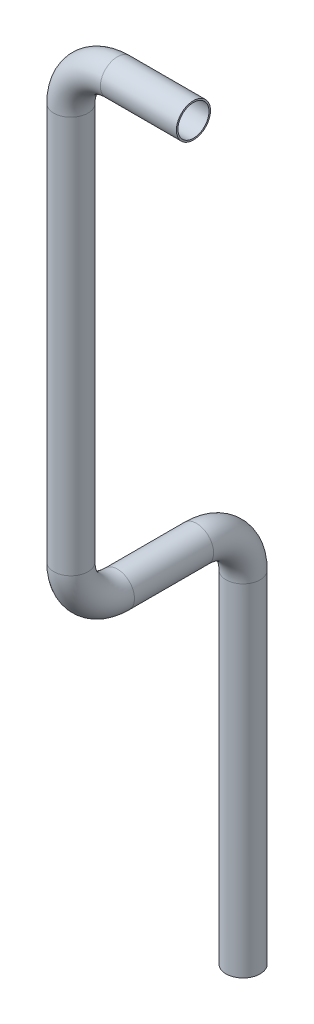
ISO-10303-21;
HEADER;
FILE_DESCRIPTION(('STEP AP214'),'2;1');
FILE_NAME('part.step','',(''),(''),'','','');
FILE_SCHEMA(('AUTOMOTIVE_DESIGN { 1 0 10303 214 1 1 1 1 }'));
ENDSEC;
DATA;
#1=APPLICATION_CONTEXT('core data for automotive mechanical design processes');
#2=APPLICATION_PROTOCOL_DEFINITION('international standard','automotive_design',2000,#1);
#3=PRODUCT_CONTEXT('',#1,'mechanical');
#4=PRODUCT('Part','Part','',(#3));
#5=PRODUCT_RELATED_PRODUCT_CATEGORY('part','',(#4));
#6=PRODUCT_DEFINITION_FORMATION('','',#4);
#7=PRODUCT_DEFINITION_CONTEXT('part definition',#1,'design');
#8=PRODUCT_DEFINITION('design','',#6,#7);
#9=PRODUCT_DEFINITION_SHAPE('','',#8);
#10=(LENGTH_UNIT() NAMED_UNIT(*) SI_UNIT(.MILLI.,.METRE.));
#11=(NAMED_UNIT(*) PLANE_ANGLE_UNIT() SI_UNIT($,.RADIAN.));
#12=(NAMED_UNIT(*) SI_UNIT($,.STERADIAN.) SOLID_ANGLE_UNIT());
#13=UNCERTAINTY_MEASURE_WITH_UNIT(LENGTH_MEASURE(1.E-05),#10,'distance_accuracy_value','');
#14=(GEOMETRIC_REPRESENTATION_CONTEXT(3) GLOBAL_UNCERTAINTY_ASSIGNED_CONTEXT((#13)) GLOBAL_UNIT_ASSIGNED_CONTEXT((#10,
#11,#12)) REPRESENTATION_CONTEXT('',''));
#15=CARTESIAN_POINT('',(0.,0.,0.));
#16=DIRECTION('',(0.,0.,1.));
#17=DIRECTION('',(1.,0.,0.));
#18=AXIS2_PLACEMENT_3D('',#15,#16,#17);
#19=CARTESIAN_POINT('',(15.,283.,55.5000000000001));
#20=DIRECTION('',(1.,0.,0.));
#21=DIRECTION('',(0.,0.,-1.));
#22=AXIS2_PLACEMENT_3D('',#19,#20,#21);
#23=CYLINDRICAL_SURFACE('',#22,5.5);
#24=CARTESIAN_POINT('',(15.,283.,55.5000000000001));
#25=DIRECTION('',(1.,0.,0.));
#26=DIRECTION('',(0.,0.,1.));
#27=AXIS2_PLACEMENT_3D('',#24,#25,#26);
#28=CIRCLE('',#27,5.5);
#29=CARTESIAN_POINT('',(15.,288.5,55.5000000000001));
#30=VERTEX_POINT('',#29);
#31=EDGE_CURVE('E45',#30,#30,#28,.T.);
#32=ORIENTED_EDGE('',*,*,#31,.T.);
#33=EDGE_LOOP('',(#32));
#34=FACE_BOUND('',#33,.T.);
#35=CARTESIAN_POINT('',(39.5,283.,55.5000000000001));
#36=DIRECTION('',(1.,0.,0.));
#37=DIRECTION('',(0.,0.,1.));
#38=AXIS2_PLACEMENT_3D('',#35,#36,#37);
#39=CIRCLE('',#38,5.5);
#40=CARTESIAN_POINT('',(39.5,283.,61.0000000000001));
#41=VERTEX_POINT('',#40);
#42=EDGE_CURVE('E10',#41,#41,#39,.T.);
#43=ORIENTED_EDGE('',*,*,#42,.F.);
#44=EDGE_LOOP('',(#43));
#45=FACE_BOUND('',#44,.T.);
#46=ADVANCED_FACE('F35',(#34,#45),#23,.T.);
#47=CARTESIAN_POINT('',(15.,283.,55.5000000000001));
#48=DIRECTION('',(1.,0.,0.));
#49=DIRECTION('',(0.,0.,-1.));
#50=AXIS2_PLACEMENT_3D('',#47,#48,#49);
#51=CYLINDRICAL_SURFACE('',#50,5.);
#52=CARTESIAN_POINT('',(15.,283.,55.5000000000001));
#53=DIRECTION('',(1.,0.,0.));
#54=DIRECTION('',(0.,0.,1.));
#55=AXIS2_PLACEMENT_3D('',#52,#53,#54);
#56=CIRCLE('',#55,5.);
#57=CARTESIAN_POINT('',(15.,288.,55.5000000000001));
#58=VERTEX_POINT('',#57);
#59=EDGE_CURVE('E49',#58,#58,#56,.T.);
#60=ORIENTED_EDGE('',*,*,#59,.F.);
#61=EDGE_LOOP('',(#60));
#62=FACE_BOUND('',#61,.T.);
#63=CARTESIAN_POINT('',(39.5,283.,55.5000000000001));
#64=DIRECTION('',(1.,0.,0.));
#65=DIRECTION('',(0.,0.,1.));
#66=AXIS2_PLACEMENT_3D('',#63,#64,#65);
#67=CIRCLE('',#66,5.);
#68=CARTESIAN_POINT('',(39.5,283.,60.5000000000001));
#69=VERTEX_POINT('',#68);
#70=EDGE_CURVE('E41',#69,#69,#67,.T.);
#71=ORIENTED_EDGE('',*,*,#70,.T.);
#72=EDGE_LOOP('',(#71));
#73=FACE_BOUND('',#72,.T.);
#74=ADVANCED_FACE('F129',(#62,#73),#51,.F.);
#75=CARTESIAN_POINT('',(15.,268.,55.5000000000001));
#76=DIRECTION('',(0.,0.,-1.));
#77=DIRECTION('',(-1.,0.,0.));
#78=AXIS2_PLACEMENT_3D('',#75,#76,#77);
#79=TOROIDAL_SURFACE('',#78,15.,5.5);
#80=CARTESIAN_POINT('',(0.,268.,55.5000000000001));
#81=DIRECTION('',(0.,1.,0.));
#82=DIRECTION('',(0.,0.,1.));
#83=AXIS2_PLACEMENT_3D('',#80,#81,#82);
#84=CIRCLE('',#83,5.5);
#85=CARTESIAN_POINT('',(-5.5,268.,55.5000000000001));
#86=VERTEX_POINT('',#85);
#87=EDGE_CURVE('E54',#86,#86,#84,.T.);
#88=CARTESIAN_POINT('',(15.,268.,55.5000000000001));
#89=DIRECTION('',(0.,0.,-1.));
#90=DIRECTION('',(-1.,0.,0.));
#91=AXIS2_PLACEMENT_3D('',#88,#89,#90);
#92=CIRCLE('',#91,20.5);
#93=EDGE_CURVE('',#86,#30,#92,.T.);
#94=ORIENTED_EDGE('',*,*,#87,.T.);
#95=ORIENTED_EDGE('',*,*,#31,.F.);
#96=ORIENTED_EDGE('',*,*,#93,.T.);
#97=ORIENTED_EDGE('',*,*,#93,.F.);
#98=EDGE_LOOP('',(#94,#96,#95,#97));
#99=FACE_BOUND('',#98,.T.);
#100=ADVANCED_FACE('F125',(#99),#79,.T.);
#101=CARTESIAN_POINT('',(15.,268.,55.5000000000001));
#102=DIRECTION('',(0.,0.,-1.));
#103=DIRECTION('',(-1.,0.,0.));
#104=AXIS2_PLACEMENT_3D('',#101,#102,#103);
#105=TOROIDAL_SURFACE('',#104,15.,5.);
#106=CARTESIAN_POINT('',(0.,268.,55.5000000000001));
#107=DIRECTION('',(0.,1.,0.));
#108=DIRECTION('',(0.,0.,1.));
#109=AXIS2_PLACEMENT_3D('',#106,#107,#108);
#110=CIRCLE('',#109,5.);
#111=CARTESIAN_POINT('',(-5.,268.,55.5000000000001));
#112=VERTEX_POINT('',#111);
#113=EDGE_CURVE('E57',#112,#112,#110,.T.);
#114=CARTESIAN_POINT('',(15.,268.,55.5000000000001));
#115=DIRECTION('',(0.,0.,-1.));
#116=DIRECTION('',(-1.,0.,0.));
#117=AXIS2_PLACEMENT_3D('',#114,#115,#116);
#118=CIRCLE('',#117,20.);
#119=EDGE_CURVE('',#112,#58,#118,.T.);
#120=ORIENTED_EDGE('',*,*,#113,.F.);
#121=ORIENTED_EDGE('',*,*,#59,.T.);
#122=ORIENTED_EDGE('',*,*,#119,.T.);
#123=ORIENTED_EDGE('',*,*,#119,.F.);
#124=EDGE_LOOP('',(#120,#122,#121,#123));
#125=FACE_BOUND('',#124,.T.);
#126=ADVANCED_FACE('F122',(#125),#105,.F.);
#127=CARTESIAN_POINT('',(0.,140.,55.5000000000001));
#128=DIRECTION('',(0.,1.,0.));
#129=DIRECTION('',(0.,0.,1.));
#130=AXIS2_PLACEMENT_3D('',#127,#128,#129);
#131=CYLINDRICAL_SURFACE('',#130,5.5);
#132=CARTESIAN_POINT('',(0.,140.,55.5000000000001));
#133=DIRECTION('',(0.,1.,0.));
#134=DIRECTION('',(0.,0.,1.));
#135=AXIS2_PLACEMENT_3D('',#132,#133,#134);
#136=CIRCLE('',#135,5.5);
#137=CARTESIAN_POINT('',(0.,140.,61.0000000000001));
#138=VERTEX_POINT('',#137);
#139=EDGE_CURVE('E60',#138,#138,#136,.T.);
#140=ORIENTED_EDGE('',*,*,#139,.T.);
#141=EDGE_LOOP('',(#140));
#142=FACE_BOUND('',#141,.T.);
#143=ORIENTED_EDGE('',*,*,#87,.F.);
#144=EDGE_LOOP('',(#143));
#145=FACE_BOUND('',#144,.T.);
#146=ADVANCED_FACE('F118',(#142,#145),#131,.T.);
#147=CARTESIAN_POINT('',(0.,140.,55.5000000000001));
#148=DIRECTION('',(0.,1.,0.));
#149=DIRECTION('',(0.,0.,1.));
#150=AXIS2_PLACEMENT_3D('',#147,#148,#149);
#151=CYLINDRICAL_SURFACE('',#150,5.);
#152=CARTESIAN_POINT('',(0.,140.,55.5000000000001));
#153=DIRECTION('',(0.,1.,0.));
#154=DIRECTION('',(0.,0.,1.));
#155=AXIS2_PLACEMENT_3D('',#152,#153,#154);
#156=CIRCLE('',#155,5.);
#157=CARTESIAN_POINT('',(0.,140.,60.5000000000001));
#158=VERTEX_POINT('',#157);
#159=EDGE_CURVE('E63',#158,#158,#156,.T.);
#160=ORIENTED_EDGE('',*,*,#159,.F.);
#161=EDGE_LOOP('',(#160));
#162=FACE_BOUND('',#161,.T.);
#163=ORIENTED_EDGE('',*,*,#113,.T.);
#164=EDGE_LOOP('',(#163));
#165=FACE_BOUND('',#164,.T.);
#166=ADVANCED_FACE('F115',(#162,#165),#151,.F.);
#167=CARTESIAN_POINT('',(0.,140.,40.5000000000001));
#168=DIRECTION('',(-1.,0.,0.));
#169=DIRECTION('',(0.,0.,1.));
#170=AXIS2_PLACEMENT_3D('',#167,#168,#169);
#171=TOROIDAL_SURFACE('',#170,15.,5.5);
#172=CARTESIAN_POINT('',(0.,125.,40.5000000000001));
#173=DIRECTION('',(0.,0.,1.));
#174=DIRECTION('',(0.,-1.,0.));
#175=AXIS2_PLACEMENT_3D('',#172,#173,#174);
#176=CIRCLE('',#175,5.5);
#177=CARTESIAN_POINT('',(0.,119.5,40.5000000000001));
#178=VERTEX_POINT('',#177);
#179=EDGE_CURVE('E66',#178,#178,#176,.T.);
#180=CARTESIAN_POINT('',(0.,140.,40.5000000000001));
#181=DIRECTION('',(-1.,0.,0.));
#182=DIRECTION('',(0.,0.,1.));
#183=AXIS2_PLACEMENT_3D('',#180,#181,#182);
#184=CIRCLE('',#183,20.5);
#185=EDGE_CURVE('',#178,#138,#184,.T.);
#186=ORIENTED_EDGE('',*,*,#179,.T.);
#187=ORIENTED_EDGE('',*,*,#139,.F.);
#188=ORIENTED_EDGE('',*,*,#185,.T.);
#189=ORIENTED_EDGE('',*,*,#185,.F.);
#190=EDGE_LOOP('',(#186,#188,#187,#189));
#191=FACE_BOUND('',#190,.T.);
#192=ADVANCED_FACE('F111',(#191),#171,.T.);
#193=CARTESIAN_POINT('',(0.,140.,40.5000000000001));
#194=DIRECTION('',(-1.,0.,0.));
#195=DIRECTION('',(0.,0.,1.));
#196=AXIS2_PLACEMENT_3D('',#193,#194,#195);
#197=TOROIDAL_SURFACE('',#196,15.,5.);
#198=CARTESIAN_POINT('',(0.,125.,40.5000000000001));
#199=DIRECTION('',(0.,0.,1.));
#200=DIRECTION('',(0.,-1.,0.));
#201=AXIS2_PLACEMENT_3D('',#198,#199,#200);
#202=CIRCLE('',#201,5.);
#203=CARTESIAN_POINT('',(0.,120.,40.5000000000001));
#204=VERTEX_POINT('',#203);
#205=EDGE_CURVE('E69',#204,#204,#202,.T.);
#206=CARTESIAN_POINT('',(0.,140.,40.5000000000001));
#207=DIRECTION('',(-1.,0.,0.));
#208=DIRECTION('',(0.,0.,1.));
#209=AXIS2_PLACEMENT_3D('',#206,#207,#208);
#210=CIRCLE('',#209,20.);
#211=EDGE_CURVE('',#204,#158,#210,.T.);
#212=ORIENTED_EDGE('',*,*,#205,.F.);
#213=ORIENTED_EDGE('',*,*,#159,.T.);
#214=ORIENTED_EDGE('',*,*,#211,.T.);
#215=ORIENTED_EDGE('',*,*,#211,.F.);
#216=EDGE_LOOP('',(#212,#214,#213,#215));
#217=FACE_BOUND('',#216,.T.);
#218=ADVANCED_FACE('F108',(#217),#197,.F.);
#219=CARTESIAN_POINT('',(0.,125.,15.));
#220=DIRECTION('',(0.,0.,1.));
#221=DIRECTION('',(1.,0.,0.));
#222=AXIS2_PLACEMENT_3D('',#219,#220,#221);
#223=CYLINDRICAL_SURFACE('',#222,5.5);
#224=CARTESIAN_POINT('',(0.,125.,15.));
#225=DIRECTION('',(0.,0.,1.));
#226=DIRECTION('',(0.,-1.,0.));
#227=AXIS2_PLACEMENT_3D('',#224,#225,#226);
#228=CIRCLE('',#227,5.5);
#229=CARTESIAN_POINT('',(0.,130.5,15.));
#230=VERTEX_POINT('',#229);
#231=EDGE_CURVE('E72',#230,#230,#228,.T.);
#232=ORIENTED_EDGE('',*,*,#231,.T.);
#233=EDGE_LOOP('',(#232));
#234=FACE_BOUND('',#233,.T.);
#235=ORIENTED_EDGE('',*,*,#179,.F.);
#236=EDGE_LOOP('',(#235));
#237=FACE_BOUND('',#236,.T.);
#238=ADVANCED_FACE('F104',(#234,#237),#223,.T.);
#239=CARTESIAN_POINT('',(0.,125.,15.));
#240=DIRECTION('',(0.,0.,1.));
#241=DIRECTION('',(1.,0.,0.));
#242=AXIS2_PLACEMENT_3D('',#239,#240,#241);
#243=CYLINDRICAL_SURFACE('',#242,5.);
#244=CARTESIAN_POINT('',(0.,125.,15.));
#245=DIRECTION('',(0.,0.,1.));
#246=DIRECTION('',(0.,-1.,0.));
#247=AXIS2_PLACEMENT_3D('',#244,#245,#246);
#248=CIRCLE('',#247,5.);
#249=CARTESIAN_POINT('',(0.,130.,15.));
#250=VERTEX_POINT('',#249);
#251=EDGE_CURVE('E75',#250,#250,#248,.T.);
#252=ORIENTED_EDGE('',*,*,#251,.F.);
#253=EDGE_LOOP('',(#252));
#254=FACE_BOUND('',#253,.T.);
#255=ORIENTED_EDGE('',*,*,#205,.T.);
#256=EDGE_LOOP('',(#255));
#257=FACE_BOUND('',#256,.T.);
#258=ADVANCED_FACE('F101',(#254,#257),#243,.F.);
#259=CARTESIAN_POINT('',(0.,110.,15.));
#260=DIRECTION('',(1.,0.,0.));
#261=DIRECTION('',(0.,0.,-1.));
#262=AXIS2_PLACEMENT_3D('',#259,#260,#261);
#263=TOROIDAL_SURFACE('',#262,15.,5.5);
#264=CARTESIAN_POINT('',(0.,110.,0.));
#265=DIRECTION('',(0.,1.,0.));
#266=DIRECTION('',(0.,0.,1.));
#267=AXIS2_PLACEMENT_3D('',#264,#265,#266);
#268=CIRCLE('',#267,5.5);
#269=CARTESIAN_POINT('',(0.,110.,-5.5));
#270=VERTEX_POINT('',#269);
#271=EDGE_CURVE('E78',#270,#270,#268,.T.);
#272=CARTESIAN_POINT('',(0.,110.,15.));
#273=DIRECTION('',(1.,0.,0.));
#274=DIRECTION('',(0.,0.,-1.));
#275=AXIS2_PLACEMENT_3D('',#272,#273,#274);
#276=CIRCLE('',#275,20.5);
#277=EDGE_CURVE('',#270,#230,#276,.T.);
#278=ORIENTED_EDGE('',*,*,#271,.T.);
#279=ORIENTED_EDGE('',*,*,#231,.F.);
#280=ORIENTED_EDGE('',*,*,#277,.T.);
#281=ORIENTED_EDGE('',*,*,#277,.F.);
#282=EDGE_LOOP('',(#278,#280,#279,#281));
#283=FACE_BOUND('',#282,.T.);
#284=ADVANCED_FACE('F97',(#283),#263,.T.);
#285=CARTESIAN_POINT('',(0.,110.,15.));
#286=DIRECTION('',(1.,0.,0.));
#287=DIRECTION('',(0.,0.,-1.));
#288=AXIS2_PLACEMENT_3D('',#285,#286,#287);
#289=TOROIDAL_SURFACE('',#288,15.,5.);
#290=CARTESIAN_POINT('',(0.,110.,0.));
#291=DIRECTION('',(0.,1.,0.));
#292=DIRECTION('',(0.,0.,1.));
#293=AXIS2_PLACEMENT_3D('',#290,#291,#292);
#294=CIRCLE('',#293,5.);
#295=CARTESIAN_POINT('',(0.,110.,-5.));
#296=VERTEX_POINT('',#295);
#297=EDGE_CURVE('E82',#296,#296,#294,.T.);
#298=CARTESIAN_POINT('',(0.,110.,15.));
#299=DIRECTION('',(1.,0.,0.));
#300=DIRECTION('',(0.,0.,-1.));
#301=AXIS2_PLACEMENT_3D('',#298,#299,#300);
#302=CIRCLE('',#301,20.);
#303=EDGE_CURVE('',#296,#250,#302,.T.);
#304=ORIENTED_EDGE('',*,*,#297,.F.);
#305=ORIENTED_EDGE('',*,*,#251,.T.);
#306=ORIENTED_EDGE('',*,*,#303,.T.);
#307=ORIENTED_EDGE('',*,*,#303,.F.);
#308=EDGE_LOOP('',(#304,#306,#305,#307));
#309=FACE_BOUND('',#308,.T.);
#310=ADVANCED_FACE('F94',(#309),#289,.F.);
#311=CARTESIAN_POINT('',(0.,110.,0.));
#312=DIRECTION('',(0.,-1.,0.));
#313=DIRECTION('',(0.,0.,-1.));
#314=AXIS2_PLACEMENT_3D('',#311,#312,#313);
#315=CYLINDRICAL_SURFACE('',#314,5.);
#316=ORIENTED_EDGE('',*,*,#297,.T.);
#317=EDGE_LOOP('',(#316));
#318=FACE_BOUND('',#317,.T.);
#319=CARTESIAN_POINT('',(0.,0.,0.));
#320=DIRECTION('',(0.,1.,0.));
#321=DIRECTION('',(0.,0.,1.));
#322=AXIS2_PLACEMENT_3D('',#319,#320,#321);
#323=CIRCLE('',#322,5.);
#324=CARTESIAN_POINT('',(0.,0.,5.));
#325=VERTEX_POINT('',#324);
#326=EDGE_CURVE('E83',#325,#325,#323,.T.);
#327=ORIENTED_EDGE('',*,*,#326,.F.);
#328=EDGE_LOOP('',(#327));
#329=FACE_BOUND('',#328,.T.);
#330=ADVANCED_FACE('F91',(#318,#329),#315,.F.);
#331=CARTESIAN_POINT('',(0.,110.,0.));
#332=DIRECTION('',(0.,-1.,0.));
#333=DIRECTION('',(0.,0.,-1.));
#334=AXIS2_PLACEMENT_3D('',#331,#332,#333);
#335=CYLINDRICAL_SURFACE('',#334,5.5);
#336=ORIENTED_EDGE('',*,*,#271,.F.);
#337=EDGE_LOOP('',(#336));
#338=FACE_BOUND('',#337,.T.);
#339=CARTESIAN_POINT('',(0.,0.,0.));
#340=DIRECTION('',(0.,1.,0.));
#341=DIRECTION('',(0.,0.,1.));
#342=AXIS2_PLACEMENT_3D('',#339,#340,#341);
#343=CIRCLE('',#342,5.5);
#344=CARTESIAN_POINT('',(0.,0.,5.5));
#345=VERTEX_POINT('',#344);
#346=EDGE_CURVE('E79',#345,#345,#343,.T.);
#347=ORIENTED_EDGE('',*,*,#346,.T.);
#348=EDGE_LOOP('',(#347));
#349=FACE_BOUND('',#348,.T.);
#350=ADVANCED_FACE('F153',(#338,#349),#335,.T.);
#351=CARTESIAN_POINT('',(39.5,283.,55.5000000000001));
#352=DIRECTION('',(1.,0.,0.));
#353=DIRECTION('',(0.,0.,1.));
#354=AXIS2_PLACEMENT_3D('',#351,#352,#353);
#355=PLANE('',#354);
#356=ORIENTED_EDGE('',*,*,#70,.F.);
#357=EDGE_LOOP('',(#356));
#358=FACE_BOUND('',#357,.T.);
#359=ORIENTED_EDGE('',*,*,#42,.T.);
#360=EDGE_LOOP('',(#359));
#361=FACE_BOUND('',#360,.T.);
#362=ADVANCED_FACE('F156',(#358,#361),#355,.T.);
#363=CARTESIAN_POINT('',(0.,0.,0.));
#364=DIRECTION('',(0.,1.,0.));
#365=DIRECTION('',(0.,0.,1.));
#366=AXIS2_PLACEMENT_3D('',#363,#364,#365);
#367=PLANE('',#366);
#368=ORIENTED_EDGE('',*,*,#326,.T.);
#369=EDGE_LOOP('',(#368));
#370=FACE_BOUND('',#369,.T.);
#371=ORIENTED_EDGE('',*,*,#346,.F.);
#372=EDGE_LOOP('',(#371));
#373=FACE_BOUND('',#372,.T.);
#374=ADVANCED_FACE('F158',(#370,#373),#367,.F.);
#375=CLOSED_SHELL('',(#46,#74,#100,#126,#146,#166,#192,#218,#238,#258,#284,#310,#330,#350,#362,#374));
#376=MANIFOLD_SOLID_BREP('B2',#375);
#377=ADVANCED_BREP_SHAPE_REPRESENTATION('',(#18,#376),#14);
#378=SHAPE_DEFINITION_REPRESENTATION(#9,#377);
ENDSEC;
END-ISO-10303-21;
